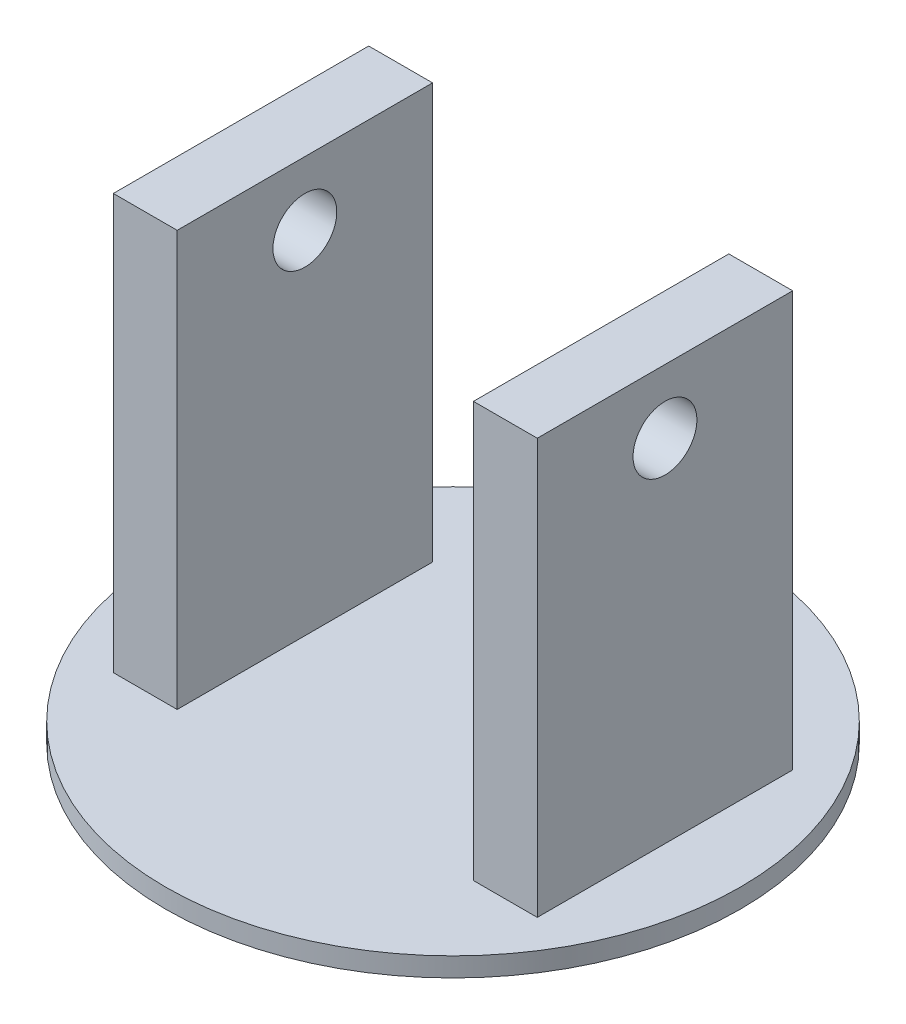
ISO-10303-21;
HEADER;
FILE_DESCRIPTION(('STEP AP214'),'2;1');
FILE_NAME('part.step','',(''),(''),'','','');
FILE_SCHEMA(('AUTOMOTIVE_DESIGN { 1 0 10303 214 1 1 1 1 }'));
ENDSEC;
DATA;
#1=APPLICATION_CONTEXT('core data for automotive mechanical design processes');
#2=APPLICATION_PROTOCOL_DEFINITION('international standard','automotive_design',2000,#1);
#3=PRODUCT_CONTEXT('',#1,'mechanical');
#4=PRODUCT('Part','Part','',(#3));
#5=PRODUCT_RELATED_PRODUCT_CATEGORY('part','',(#4));
#6=PRODUCT_DEFINITION_FORMATION('','',#4);
#7=PRODUCT_DEFINITION_CONTEXT('part definition',#1,'design');
#8=PRODUCT_DEFINITION('design','',#6,#7);
#9=PRODUCT_DEFINITION_SHAPE('','',#8);
#10=(LENGTH_UNIT() NAMED_UNIT(*) SI_UNIT(.MILLI.,.METRE.));
#11=(NAMED_UNIT(*) PLANE_ANGLE_UNIT() SI_UNIT($,.RADIAN.));
#12=(NAMED_UNIT(*) SI_UNIT($,.STERADIAN.) SOLID_ANGLE_UNIT());
#13=UNCERTAINTY_MEASURE_WITH_UNIT(LENGTH_MEASURE(1.E-05),#10,'distance_accuracy_value','');
#14=(GEOMETRIC_REPRESENTATION_CONTEXT(3) GLOBAL_UNCERTAINTY_ASSIGNED_CONTEXT((#13)) GLOBAL_UNIT_ASSIGNED_CONTEXT((#10,
#11,#12)) REPRESENTATION_CONTEXT('',''));
#15=CARTESIAN_POINT('',(0.,0.,0.));
#16=DIRECTION('',(0.,0.,1.));
#17=DIRECTION('',(1.,0.,0.));
#18=AXIS2_PLACEMENT_3D('',#15,#16,#17);
#19=CARTESIAN_POINT('',(0.,3.,0.));
#20=DIRECTION('',(0.,1.,0.));
#21=DIRECTION('',(0.,0.,1.));
#22=AXIS2_PLACEMENT_3D('',#19,#20,#21);
#23=PLANE('',#22);
#24=DIRECTION('',(-1.,0.,0.));
#25=VECTOR('',#24,1.);
#26=CARTESIAN_POINT('',(1.45716771982052E-13,3.,20.));
#27=LINE('',#26,#25);
#28=CARTESIAN_POINT('',(33.2008073428629,3.,19.9999999999998));
#29=VERTEX_POINT('',#28);
#30=CARTESIAN_POINT('',(23.2008073428629,3.,19.9999999999999));
#31=VERTEX_POINT('',#30);
#32=EDGE_CURVE('E114',#29,#31,#27,.T.);
#33=ORIENTED_EDGE('',*,*,#32,.T.);
#34=DIRECTION('',(0.,0.,-1.));
#35=VECTOR('',#34,1.);
#36=CARTESIAN_POINT('',(23.2008073428628,3.,-1.60987940637117E-13));
#37=LINE('',#36,#35);
#38=CARTESIAN_POINT('',(23.2008073428626,3.,-20.0000000000001));
#39=VERTEX_POINT('',#38);
#40=EDGE_CURVE('E133',#31,#39,#37,.T.);
#41=ORIENTED_EDGE('',*,*,#40,.T.);
#42=DIRECTION('',(-1.,0.,0.));
#43=VECTOR('',#42,1.);
#44=CARTESIAN_POINT('',(-1.31838984174237E-13,3.,-20.));
#45=LINE('',#44,#43);
#46=CARTESIAN_POINT('',(33.2008073428626,3.,-20.0000000000002));
#47=VERTEX_POINT('',#46);
#48=EDGE_CURVE('E64',#47,#39,#45,.T.);
#49=ORIENTED_EDGE('',*,*,#48,.F.);
#50=DIRECTION('',(0.,0.,-1.));
#51=VECTOR('',#50,1.);
#52=CARTESIAN_POINT('',(33.2008073428628,3.,-2.30376879676189E-13));
#53=LINE('',#52,#51);
#54=EDGE_CURVE('E59',#29,#47,#53,.T.);
#55=ORIENTED_EDGE('',*,*,#54,.F.);
#56=EDGE_LOOP('',(#33,#41,#49,#55));
#57=FACE_BOUND('',#56,.T.);
#58=CARTESIAN_POINT('',(0.,3.,0.));
#59=DIRECTION('',(0.,1.,0.));
#60=DIRECTION('',(0.,0.,1.));
#61=AXIS2_PLACEMENT_3D('',#58,#59,#60);
#62=CIRCLE('',#61,45.);
#63=CARTESIAN_POINT('',(0.,3.,45.));
#64=VERTEX_POINT('',#63);
#65=EDGE_CURVE('E11',#64,#64,#62,.T.);
#66=ORIENTED_EDGE('',*,*,#65,.T.);
#67=EDGE_LOOP('',(#66));
#68=FACE_BOUND('',#67,.T.);
#69=DIRECTION('',(0.,0.,-1.));
#70=VECTOR('',#69,1.);
#71=CARTESIAN_POINT('',(-23.2008073428628,3.,0.));
#72=LINE('',#71,#70);
#73=CARTESIAN_POINT('',(-23.2008073428628,3.,20.));
#74=VERTEX_POINT('',#73);
#75=CARTESIAN_POINT('',(-23.2008073428628,3.,-20.));
#76=VERTEX_POINT('',#75);
#77=EDGE_CURVE('E180',#74,#76,#72,.T.);
#78=ORIENTED_EDGE('',*,*,#77,.F.);
#79=DIRECTION('',(1.,0.,0.));
#80=VECTOR('',#79,1.);
#81=CARTESIAN_POINT('',(0.,3.,20.));
#82=LINE('',#81,#80);
#83=CARTESIAN_POINT('',(-33.2008073428628,3.,20.));
#84=VERTEX_POINT('',#83);
#85=EDGE_CURVE('E117',#84,#74,#82,.T.);
#86=ORIENTED_EDGE('',*,*,#85,.F.);
#87=DIRECTION('',(0.,0.,-1.));
#88=VECTOR('',#87,1.);
#89=CARTESIAN_POINT('',(-33.2008073428628,3.,0.));
#90=LINE('',#89,#88);
#91=CARTESIAN_POINT('',(-33.2008073428628,3.,-20.));
#92=VERTEX_POINT('',#91);
#93=EDGE_CURVE('E165',#84,#92,#90,.T.);
#94=ORIENTED_EDGE('',*,*,#93,.T.);
#95=DIRECTION('',(1.,0.,0.));
#96=VECTOR('',#95,1.);
#97=CARTESIAN_POINT('',(0.,3.,-20.));
#98=LINE('',#97,#96);
#99=EDGE_CURVE('E184',#92,#76,#98,.T.);
#100=ORIENTED_EDGE('',*,*,#99,.T.);
#101=EDGE_LOOP('',(#78,#86,#94,#100));
#102=FACE_BOUND('',#101,.T.);
#103=ADVANCED_FACE('F41',(#57,#68,#102),#23,.T.);
#104=CARTESIAN_POINT('',(0.,3.,0.));
#105=DIRECTION('',(0.,-1.,0.));
#106=DIRECTION('',(0.,0.,-1.));
#107=AXIS2_PLACEMENT_3D('',#104,#105,#106);
#108=CYLINDRICAL_SURFACE('',#107,45.);
#109=ORIENTED_EDGE('',*,*,#65,.F.);
#110=EDGE_LOOP('',(#109));
#111=FACE_BOUND('',#110,.T.);
#112=CARTESIAN_POINT('',(0.,0.,0.));
#113=DIRECTION('',(0.,1.,0.));
#114=DIRECTION('',(0.,0.,1.));
#115=AXIS2_PLACEMENT_3D('',#112,#113,#114);
#116=CIRCLE('',#115,45.);
#117=CARTESIAN_POINT('',(0.,0.,45.));
#118=VERTEX_POINT('',#117);
#119=EDGE_CURVE('E51',#118,#118,#116,.T.);
#120=ORIENTED_EDGE('',*,*,#119,.T.);
#121=EDGE_LOOP('',(#120));
#122=FACE_BOUND('',#121,.T.);
#123=ADVANCED_FACE('F43',(#111,#122),#108,.T.);
#124=CARTESIAN_POINT('',(0.,0.,0.));
#125=DIRECTION('',(0.,1.,0.));
#126=DIRECTION('',(0.,0.,1.));
#127=AXIS2_PLACEMENT_3D('',#124,#125,#126);
#128=PLANE('',#127);
#129=ORIENTED_EDGE('',*,*,#119,.F.);
#130=EDGE_LOOP('',(#129));
#131=FACE_BOUND('',#130,.T.);
#132=ADVANCED_FACE('F208',(#131),#128,.F.);
#133=CARTESIAN_POINT('',(0.,68.,20.));
#134=DIRECTION('',(0.,0.,-1.));
#135=DIRECTION('',(-1.,0.,0.));
#136=AXIS2_PLACEMENT_3D('',#133,#134,#135);
#137=PLANE('',#136);
#138=ORIENTED_EDGE('',*,*,#85,.T.);
#139=DIRECTION('',(0.,-1.,0.));
#140=VECTOR('',#139,1.);
#141=CARTESIAN_POINT('',(-23.2008073428628,68.,20.));
#142=LINE('',#141,#140);
#143=CARTESIAN_POINT('',(-23.2008073428628,68.,20.));
#144=VERTEX_POINT('',#143);
#145=EDGE_CURVE('E200',#144,#74,#142,.T.);
#146=ORIENTED_EDGE('',*,*,#145,.F.);
#147=DIRECTION('',(1.,0.,0.));
#148=VECTOR('',#147,1.);
#149=CARTESIAN_POINT('',(0.,68.,20.));
#150=LINE('',#149,#148);
#151=CARTESIAN_POINT('',(-33.2008073428628,68.,20.));
#152=VERTEX_POINT('',#151);
#153=EDGE_CURVE('E160',#152,#144,#150,.T.);
#154=ORIENTED_EDGE('',*,*,#153,.F.);
#155=DIRECTION('',(0.,-1.,0.));
#156=VECTOR('',#155,1.);
#157=CARTESIAN_POINT('',(-33.2008073428628,68.,20.));
#158=LINE('',#157,#156);
#159=EDGE_CURVE('E176',#152,#84,#158,.T.);
#160=ORIENTED_EDGE('',*,*,#159,.T.);
#161=EDGE_LOOP('',(#138,#146,#154,#160));
#162=FACE_BOUND('',#161,.T.);
#163=ADVANCED_FACE('F210',(#162),#137,.F.);
#164=CARTESIAN_POINT('',(-23.2008073428628,68.,0.));
#165=DIRECTION('',(-1.,0.,0.));
#166=DIRECTION('',(0.,0.,1.));
#167=AXIS2_PLACEMENT_3D('',#164,#165,#166);
#168=PLANE('',#167);
#169=CARTESIAN_POINT('',(-23.2008073428628,58.,0.));
#170=DIRECTION('',(-1.,0.,0.));
#171=DIRECTION('',(0.,0.,1.));
#172=AXIS2_PLACEMENT_3D('',#169,#170,#171);
#173=CIRCLE('',#172,5.);
#174=CARTESIAN_POINT('',(-23.2008073428628,58.,5.));
#175=VERTEX_POINT('',#174);
#176=EDGE_CURVE('E138',#175,#175,#173,.T.);
#177=ORIENTED_EDGE('',*,*,#176,.T.);
#178=EDGE_LOOP('',(#177));
#179=FACE_BOUND('',#178,.T.);
#180=ORIENTED_EDGE('',*,*,#77,.T.);
#181=DIRECTION('',(0.,-1.,0.));
#182=VECTOR('',#181,1.);
#183=CARTESIAN_POINT('',(-23.2008073428628,68.,-20.));
#184=LINE('',#183,#182);
#185=CARTESIAN_POINT('',(-23.2008073428628,68.,-20.));
#186=VERTEX_POINT('',#185);
#187=EDGE_CURVE('E196',#186,#76,#184,.T.);
#188=ORIENTED_EDGE('',*,*,#187,.F.);
#189=DIRECTION('',(0.,0.,-1.));
#190=VECTOR('',#189,1.);
#191=CARTESIAN_POINT('',(-23.2008073428628,68.,0.));
#192=LINE('',#191,#190);
#193=EDGE_CURVE('E164',#144,#186,#192,.T.);
#194=ORIENTED_EDGE('',*,*,#193,.F.);
#195=ORIENTED_EDGE('',*,*,#145,.T.);
#196=EDGE_LOOP('',(#180,#188,#194,#195));
#197=FACE_BOUND('',#196,.T.);
#198=ADVANCED_FACE('F215',(#179,#197),#168,.F.);
#199=CARTESIAN_POINT('',(0.,68.,-20.));
#200=DIRECTION('',(0.,0.,-1.));
#201=DIRECTION('',(-1.,0.,0.));
#202=AXIS2_PLACEMENT_3D('',#199,#200,#201);
#203=PLANE('',#202);
#204=ORIENTED_EDGE('',*,*,#99,.F.);
#205=DIRECTION('',(0.,-1.,0.));
#206=VECTOR('',#205,1.);
#207=CARTESIAN_POINT('',(-33.2008073428628,68.,-20.));
#208=LINE('',#207,#206);
#209=CARTESIAN_POINT('',(-33.2008073428628,68.,-20.));
#210=VERTEX_POINT('',#209);
#211=EDGE_CURVE('E192',#210,#92,#208,.T.);
#212=ORIENTED_EDGE('',*,*,#211,.F.);
#213=DIRECTION('',(1.,0.,0.));
#214=VECTOR('',#213,1.);
#215=CARTESIAN_POINT('',(0.,68.,-20.));
#216=LINE('',#215,#214);
#217=EDGE_CURVE('E168',#210,#186,#216,.T.);
#218=ORIENTED_EDGE('',*,*,#217,.T.);
#219=ORIENTED_EDGE('',*,*,#187,.T.);
#220=EDGE_LOOP('',(#204,#212,#218,#219));
#221=FACE_BOUND('',#220,.T.);
#222=ADVANCED_FACE('F227',(#221),#203,.T.);
#223=CARTESIAN_POINT('',(-33.2008073428628,68.,0.));
#224=DIRECTION('',(-1.,0.,0.));
#225=DIRECTION('',(0.,0.,1.));
#226=AXIS2_PLACEMENT_3D('',#223,#224,#225);
#227=PLANE('',#226);
#228=CARTESIAN_POINT('',(-33.2008073428628,58.,0.));
#229=DIRECTION('',(-1.,0.,0.));
#230=DIRECTION('',(0.,0.,1.));
#231=AXIS2_PLACEMENT_3D('',#228,#229,#230);
#232=CIRCLE('',#231,5.);
#233=CARTESIAN_POINT('',(-33.2008073428628,58.,5.));
#234=VERTEX_POINT('',#233);
#235=EDGE_CURVE('E270',#234,#234,#232,.T.);
#236=ORIENTED_EDGE('',*,*,#235,.F.);
#237=EDGE_LOOP('',(#236));
#238=FACE_BOUND('',#237,.T.);
#239=ORIENTED_EDGE('',*,*,#93,.F.);
#240=ORIENTED_EDGE('',*,*,#159,.F.);
#241=DIRECTION('',(0.,0.,-1.));
#242=VECTOR('',#241,1.);
#243=CARTESIAN_POINT('',(-33.2008073428628,68.,0.));
#244=LINE('',#243,#242);
#245=EDGE_CURVE('E172',#152,#210,#244,.T.);
#246=ORIENTED_EDGE('',*,*,#245,.T.);
#247=ORIENTED_EDGE('',*,*,#211,.T.);
#248=EDGE_LOOP('',(#239,#240,#246,#247));
#249=FACE_BOUND('',#248,.T.);
#250=ADVANCED_FACE('F231',(#238,#249),#227,.T.);
#251=CARTESIAN_POINT('',(0.,68.,0.));
#252=DIRECTION('',(0.,1.,0.));
#253=DIRECTION('',(0.,0.,1.));
#254=AXIS2_PLACEMENT_3D('',#251,#252,#253);
#255=PLANE('',#254);
#256=ORIENTED_EDGE('',*,*,#153,.T.);
#257=ORIENTED_EDGE('',*,*,#193,.T.);
#258=ORIENTED_EDGE('',*,*,#217,.F.);
#259=ORIENTED_EDGE('',*,*,#245,.F.);
#260=EDGE_LOOP('',(#256,#257,#258,#259));
#261=FACE_BOUND('',#260,.T.);
#262=ADVANCED_FACE('F235',(#261),#255,.T.);
#263=CARTESIAN_POINT('',(1.45716771982052E-13,68.,20.));
#264=DIRECTION('',(0.,0.,1.));
#265=DIRECTION('',(1.,0.,0.));
#266=AXIS2_PLACEMENT_3D('',#263,#264,#265);
#267=PLANE('',#266);
#268=ORIENTED_EDGE('',*,*,#32,.F.);
#269=DIRECTION('',(0.,-1.,0.));
#270=VECTOR('',#269,1.);
#271=CARTESIAN_POINT('',(33.2008073428629,68.,19.9999999999998));
#272=LINE('',#271,#270);
#273=CARTESIAN_POINT('',(33.2008073428629,68.,19.9999999999998));
#274=VERTEX_POINT('',#273);
#275=EDGE_CURVE('E107',#274,#29,#272,.T.);
#276=ORIENTED_EDGE('',*,*,#275,.F.);
#277=DIRECTION('',(-1.,0.,0.));
#278=VECTOR('',#277,1.);
#279=CARTESIAN_POINT('',(1.45716771982052E-13,68.,20.));
#280=LINE('',#279,#278);
#281=CARTESIAN_POINT('',(23.2008073428629,68.,19.9999999999999));
#282=VERTEX_POINT('',#281);
#283=EDGE_CURVE('E112',#274,#282,#280,.T.);
#284=ORIENTED_EDGE('',*,*,#283,.T.);
#285=DIRECTION('',(0.,-1.,0.));
#286=VECTOR('',#285,1.);
#287=CARTESIAN_POINT('',(23.2008073428629,68.,19.9999999999999));
#288=LINE('',#287,#286);
#289=EDGE_CURVE('E145',#282,#31,#288,.T.);
#290=ORIENTED_EDGE('',*,*,#289,.T.);
#291=EDGE_LOOP('',(#268,#276,#284,#290));
#292=FACE_BOUND('',#291,.T.);
#293=ADVANCED_FACE('F109',(#292),#267,.T.);
#294=CARTESIAN_POINT('',(33.2008073428628,68.,-2.30376879676189E-13));
#295=DIRECTION('',(-1.,0.,0.));
#296=DIRECTION('',(0.,0.,1.));
#297=AXIS2_PLACEMENT_3D('',#294,#295,#296);
#298=PLANE('',#297);
#299=CARTESIAN_POINT('',(33.2008073428628,58.,0.));
#300=DIRECTION('',(-1.,0.,0.));
#301=DIRECTION('',(0.,0.,1.));
#302=AXIS2_PLACEMENT_3D('',#299,#300,#301);
#303=CIRCLE('',#302,5.);
#304=CARTESIAN_POINT('',(33.2008073428628,58.,5.));
#305=VERTEX_POINT('',#304);
#306=EDGE_CURVE('E268',#305,#305,#303,.F.);
#307=ORIENTED_EDGE('',*,*,#306,.F.);
#308=EDGE_LOOP('',(#307));
#309=FACE_BOUND('',#308,.T.);
#310=ORIENTED_EDGE('',*,*,#54,.T.);
#311=DIRECTION('',(0.,-1.,0.));
#312=VECTOR('',#311,1.);
#313=CARTESIAN_POINT('',(33.2008073428626,68.,-20.0000000000002));
#314=LINE('',#313,#312);
#315=CARTESIAN_POINT('',(33.2008073428626,68.,-20.0000000000002));
#316=VERTEX_POINT('',#315);
#317=EDGE_CURVE('E118',#316,#47,#314,.T.);
#318=ORIENTED_EDGE('',*,*,#317,.F.);
#319=DIRECTION('',(0.,0.,-1.));
#320=VECTOR('',#319,1.);
#321=CARTESIAN_POINT('',(33.2008073428628,68.,-2.30376879676189E-13));
#322=LINE('',#321,#320);
#323=EDGE_CURVE('E121',#274,#316,#322,.T.);
#324=ORIENTED_EDGE('',*,*,#323,.F.);
#325=ORIENTED_EDGE('',*,*,#275,.T.);
#326=EDGE_LOOP('',(#310,#318,#324,#325));
#327=FACE_BOUND('',#326,.T.);
#328=ADVANCED_FACE('F122',(#309,#327),#298,.F.);
#329=CARTESIAN_POINT('',(-1.31838984174237E-13,68.,-20.));
#330=DIRECTION('',(0.,0.,1.));
#331=DIRECTION('',(1.,0.,0.));
#332=AXIS2_PLACEMENT_3D('',#329,#330,#331);
#333=PLANE('',#332);
#334=ORIENTED_EDGE('',*,*,#48,.T.);
#335=DIRECTION('',(0.,-1.,0.));
#336=VECTOR('',#335,1.);
#337=CARTESIAN_POINT('',(23.2008073428626,68.,-20.0000000000001));
#338=LINE('',#337,#336);
#339=CARTESIAN_POINT('',(23.2008073428626,68.,-20.0000000000001));
#340=VERTEX_POINT('',#339);
#341=EDGE_CURVE('E154',#340,#39,#338,.T.);
#342=ORIENTED_EDGE('',*,*,#341,.F.);
#343=DIRECTION('',(-1.,0.,0.));
#344=VECTOR('',#343,1.);
#345=CARTESIAN_POINT('',(-1.31838984174237E-13,68.,-20.));
#346=LINE('',#345,#344);
#347=EDGE_CURVE('E127',#316,#340,#346,.T.);
#348=ORIENTED_EDGE('',*,*,#347,.F.);
#349=ORIENTED_EDGE('',*,*,#317,.T.);
#350=EDGE_LOOP('',(#334,#342,#348,#349));
#351=FACE_BOUND('',#350,.T.);
#352=ADVANCED_FACE('F244',(#351),#333,.F.);
#353=CARTESIAN_POINT('',(23.2008073428628,68.,-1.60987940637117E-13));
#354=DIRECTION('',(-1.,0.,0.));
#355=DIRECTION('',(0.,0.,1.));
#356=AXIS2_PLACEMENT_3D('',#353,#354,#355);
#357=PLANE('',#356);
#358=CARTESIAN_POINT('',(23.2008073428628,58.,0.));
#359=DIRECTION('',(-1.,0.,0.));
#360=DIRECTION('',(0.,0.,1.));
#361=AXIS2_PLACEMENT_3D('',#358,#359,#360);
#362=CIRCLE('',#361,5.);
#363=CARTESIAN_POINT('',(23.2008073428628,58.,5.));
#364=VERTEX_POINT('',#363);
#365=EDGE_CURVE('E45',#364,#364,#362,.T.);
#366=ORIENTED_EDGE('',*,*,#365,.F.);
#367=EDGE_LOOP('',(#366));
#368=FACE_BOUND('',#367,.T.);
#369=ORIENTED_EDGE('',*,*,#40,.F.);
#370=ORIENTED_EDGE('',*,*,#289,.F.);
#371=DIRECTION('',(0.,0.,-1.));
#372=VECTOR('',#371,1.);
#373=CARTESIAN_POINT('',(23.2008073428628,68.,-1.60987940637117E-13));
#374=LINE('',#373,#372);
#375=EDGE_CURVE('E131',#282,#340,#374,.T.);
#376=ORIENTED_EDGE('',*,*,#375,.T.);
#377=ORIENTED_EDGE('',*,*,#341,.T.);
#378=EDGE_LOOP('',(#369,#370,#376,#377));
#379=FACE_BOUND('',#378,.T.);
#380=ADVANCED_FACE('F248',(#368,#379),#357,.T.);
#381=CARTESIAN_POINT('',(0.,68.,0.));
#382=DIRECTION('',(0.,1.,0.));
#383=DIRECTION('',(0.,0.,1.));
#384=AXIS2_PLACEMENT_3D('',#381,#382,#383);
#385=PLANE('',#384);
#386=ORIENTED_EDGE('',*,*,#283,.F.);
#387=ORIENTED_EDGE('',*,*,#323,.T.);
#388=ORIENTED_EDGE('',*,*,#347,.T.);
#389=ORIENTED_EDGE('',*,*,#375,.F.);
#390=EDGE_LOOP('',(#386,#387,#388,#389));
#391=FACE_BOUND('',#390,.T.);
#392=ADVANCED_FACE('F129',(#391),#385,.T.);
#393=CARTESIAN_POINT('',(47.3429429665937,58.,0.));
#394=DIRECTION('',(-1.,0.,0.));
#395=DIRECTION('',(0.,0.,1.));
#396=AXIS2_PLACEMENT_3D('',#393,#394,#395);
#397=CYLINDRICAL_SURFACE('',#396,5.);
#398=ORIENTED_EDGE('',*,*,#365,.T.);
#399=EDGE_LOOP('',(#398));
#400=FACE_BOUND('',#399,.T.);
#401=ORIENTED_EDGE('',*,*,#306,.T.);
#402=EDGE_LOOP('',(#401));
#403=FACE_BOUND('',#402,.T.);
#404=ADVANCED_FACE('F255',(#400,#403),#397,.F.);
#405=ORIENTED_EDGE('',*,*,#235,.T.);
#406=EDGE_LOOP('',(#405));
#407=FACE_BOUND('',#406,.T.);
#408=ORIENTED_EDGE('',*,*,#176,.F.);
#409=EDGE_LOOP('',(#408));
#410=FACE_BOUND('',#409,.T.);
#411=ADVANCED_FACE('F257',(#407,#410),#397,.F.);
#412=CLOSED_SHELL('',(#103,#123,#132,#163,#198,#222,#250,#262,#293,#328,#352,#380,#392,#404,#411));
#413=MANIFOLD_SOLID_BREP('B2',#412);
#414=ADVANCED_BREP_SHAPE_REPRESENTATION('',(#18,#413),#14);
#415=SHAPE_DEFINITION_REPRESENTATION(#9,#414);
ENDSEC;
END-ISO-10303-21;
